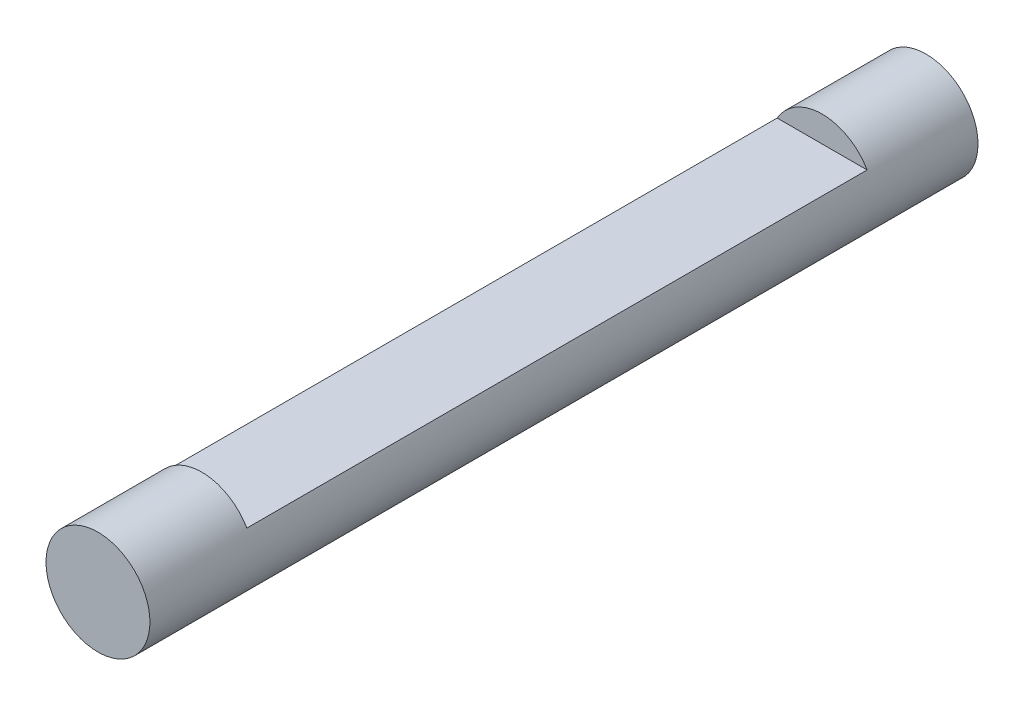
ISO-10303-21;
HEADER;
FILE_DESCRIPTION(('STEP AP214'),'2;1');
FILE_NAME('part.step','',(''),(''),'','','');
FILE_SCHEMA(('AUTOMOTIVE_DESIGN { 1 0 10303 214 1 1 1 1 }'));
ENDSEC;
DATA;
#1=APPLICATION_CONTEXT('core data for automotive mechanical design processes');
#2=APPLICATION_PROTOCOL_DEFINITION('international standard','automotive_design',2000,#1);
#3=PRODUCT_CONTEXT('',#1,'mechanical');
#4=PRODUCT('Part','Part','',(#3));
#5=PRODUCT_RELATED_PRODUCT_CATEGORY('part','',(#4));
#6=PRODUCT_DEFINITION_FORMATION('','',#4);
#7=PRODUCT_DEFINITION_CONTEXT('part definition',#1,'design');
#8=PRODUCT_DEFINITION('design','',#6,#7);
#9=PRODUCT_DEFINITION_SHAPE('','',#8);
#10=(LENGTH_UNIT() NAMED_UNIT(*) SI_UNIT(.MILLI.,.METRE.));
#11=(NAMED_UNIT(*) PLANE_ANGLE_UNIT() SI_UNIT($,.RADIAN.));
#12=(NAMED_UNIT(*) SI_UNIT($,.STERADIAN.) SOLID_ANGLE_UNIT());
#13=UNCERTAINTY_MEASURE_WITH_UNIT(LENGTH_MEASURE(1.E-05),#10,'distance_accuracy_value','');
#14=(GEOMETRIC_REPRESENTATION_CONTEXT(3) GLOBAL_UNCERTAINTY_ASSIGNED_CONTEXT((#13)) GLOBAL_UNIT_ASSIGNED_CONTEXT((#10,
#11,#12)) REPRESENTATION_CONTEXT('',''));
#15=CARTESIAN_POINT('',(0.,0.,0.));
#16=DIRECTION('',(0.,0.,1.));
#17=DIRECTION('',(1.,0.,0.));
#18=AXIS2_PLACEMENT_3D('',#15,#16,#17);
#19=CARTESIAN_POINT('',(0.,0.,75.0737084989847));
#20=DIRECTION('',(0.,0.,-1.));
#21=DIRECTION('',(-1.,0.,0.));
#22=AXIS2_PLACEMENT_3D('',#19,#20,#21);
#23=CYLINDRICAL_SURFACE('',#22,4.);
#24=CARTESIAN_POINT('',(0.,0.,63.76));
#25=DIRECTION('',(0.,0.,-1.));
#26=DIRECTION('',(-1.,0.,0.));
#27=AXIS2_PLACEMENT_3D('',#24,#25,#26);
#28=CIRCLE('',#27,4.);
#29=CARTESIAN_POINT('',(-4.,0.,63.76));
#30=VERTEX_POINT('',#29);
#31=EDGE_CURVE('E71',#30,#30,#28,.T.);
#32=ORIENTED_EDGE('',*,*,#31,.T.);
#33=EDGE_LOOP('',(#32));
#34=FACE_BOUND('',#33,.T.);
#35=CARTESIAN_POINT('',(0.,0.,0.));
#36=DIRECTION('',(0.,0.,1.));
#37=DIRECTION('',(1.,0.,0.));
#38=AXIS2_PLACEMENT_3D('',#35,#36,#37);
#39=CIRCLE('',#38,4.);
#40=CARTESIAN_POINT('',(4.,0.,0.));
#41=VERTEX_POINT('',#40);
#42=EDGE_CURVE('E68',#41,#41,#39,.T.);
#43=ORIENTED_EDGE('',*,*,#42,.T.);
#44=EDGE_LOOP('',(#43));
#45=FACE_BOUND('',#44,.T.);
#46=DIRECTION('',(0.,0.,-1.));
#47=VECTOR('',#46,1.);
#48=CARTESIAN_POINT('',(3.46410161513775,2.,75.0737084989847));
#49=LINE('',#48,#47);
#50=CARTESIAN_POINT('',(3.46410161513775,2.,55.76));
#51=VERTEX_POINT('',#50);
#52=CARTESIAN_POINT('',(3.46410161513775,2.,8.));
#53=VERTEX_POINT('',#52);
#54=EDGE_CURVE('E11',#51,#53,#49,.T.);
#55=ORIENTED_EDGE('',*,*,#54,.F.);
#56=CARTESIAN_POINT('',(0.,0.,55.76));
#57=DIRECTION('',(0.,0.,-1.));
#58=DIRECTION('',(-1.,0.,0.));
#59=AXIS2_PLACEMENT_3D('',#56,#57,#58);
#60=CIRCLE('',#59,4.);
#61=CARTESIAN_POINT('',(-3.46410161513775,2.,55.76));
#62=VERTEX_POINT('',#61);
#63=EDGE_CURVE('E40',#62,#51,#60,.T.);
#64=ORIENTED_EDGE('',*,*,#63,.F.);
#65=DIRECTION('',(0.,0.,-1.));
#66=VECTOR('',#65,1.);
#67=CARTESIAN_POINT('',(-3.46410161513775,2.,75.0737084989847));
#68=LINE('',#67,#66);
#69=CARTESIAN_POINT('',(-3.46410161513775,2.,8.00000000000001));
#70=VERTEX_POINT('',#69);
#71=EDGE_CURVE('E62',#70,#62,#68,.F.);
#72=ORIENTED_EDGE('',*,*,#71,.F.);
#73=CARTESIAN_POINT('',(0.,0.,8.00000000000001));
#74=DIRECTION('',(0.,0.,1.));
#75=DIRECTION('',(1.,0.,0.));
#76=AXIS2_PLACEMENT_3D('',#73,#74,#75);
#77=CIRCLE('',#76,4.);
#78=EDGE_CURVE('E61',#53,#70,#77,.T.);
#79=ORIENTED_EDGE('',*,*,#78,.F.);
#80=EDGE_LOOP('',(#55,#64,#72,#79));
#81=FACE_BOUND('',#80,.T.);
#82=ADVANCED_FACE('F33',(#34,#45,#81),#23,.T.);
#83=CARTESIAN_POINT('',(0.,0.,0.));
#84=DIRECTION('',(0.,0.,1.));
#85=DIRECTION('',(1.,0.,0.));
#86=AXIS2_PLACEMENT_3D('',#83,#84,#85);
#87=PLANE('',#86);
#88=ORIENTED_EDGE('',*,*,#42,.F.);
#89=EDGE_LOOP('',(#88));
#90=FACE_BOUND('',#89,.T.);
#91=ADVANCED_FACE('F86',(#90),#87,.F.);
#92=CARTESIAN_POINT('',(-5.24688900946858,-2.9103531954607,63.76));
#93=DIRECTION('',(0.,0.,-1.));
#94=DIRECTION('',(-0.874481501577933,-0.485058865910112,0.));
#95=AXIS2_PLACEMENT_3D('',#92,#93,#94);
#96=PLANE('',#95);
#97=ORIENTED_EDGE('',*,*,#31,.F.);
#98=EDGE_LOOP('',(#97));
#99=FACE_BOUND('',#98,.T.);
#100=ADVANCED_FACE('F79',(#99),#96,.F.);
#101=CARTESIAN_POINT('',(-3.99999999999999,4.,55.76));
#102=DIRECTION('',(0.,0.,-1.));
#103=DIRECTION('',(-1.,0.,0.));
#104=AXIS2_PLACEMENT_3D('',#101,#102,#103);
#105=PLANE('',#104);
#106=ORIENTED_EDGE('',*,*,#63,.T.);
#107=DIRECTION('',(1.,0.,0.));
#108=VECTOR('',#107,1.);
#109=CARTESIAN_POINT('',(-3.99999999999999,2.,55.76));
#110=LINE('',#109,#108);
#111=EDGE_CURVE('E66',#62,#51,#110,.T.);
#112=ORIENTED_EDGE('',*,*,#111,.F.);
#113=EDGE_LOOP('',(#106,#112));
#114=FACE_BOUND('',#113,.T.);
#115=ADVANCED_FACE('F77',(#114),#105,.T.);
#116=CARTESIAN_POINT('',(-4.,4.,8.));
#117=DIRECTION('',(0.,0.,1.));
#118=DIRECTION('',(1.,0.,0.));
#119=AXIS2_PLACEMENT_3D('',#116,#117,#118);
#120=PLANE('',#119);
#121=DIRECTION('',(-1.,0.,0.));
#122=VECTOR('',#121,1.);
#123=CARTESIAN_POINT('',(-4.,2.,8.));
#124=LINE('',#123,#122);
#125=EDGE_CURVE('E46',#53,#70,#124,.T.);
#126=ORIENTED_EDGE('',*,*,#125,.F.);
#127=ORIENTED_EDGE('',*,*,#78,.T.);
#128=EDGE_LOOP('',(#126,#127));
#129=FACE_BOUND('',#128,.T.);
#130=ADVANCED_FACE('F67',(#129),#120,.T.);
#131=CARTESIAN_POINT('',(0.,2.,0.));
#132=DIRECTION('',(0.,1.,0.));
#133=DIRECTION('',(0.,0.,1.));
#134=AXIS2_PLACEMENT_3D('',#131,#132,#133);
#135=PLANE('',#134);
#136=ORIENTED_EDGE('',*,*,#54,.T.);
#137=ORIENTED_EDGE('',*,*,#125,.T.);
#138=ORIENTED_EDGE('',*,*,#71,.T.);
#139=ORIENTED_EDGE('',*,*,#111,.T.);
#140=EDGE_LOOP('',(#136,#137,#138,#139));
#141=FACE_BOUND('',#140,.T.);
#142=ADVANCED_FACE('F65',(#141),#135,.T.);
#143=CLOSED_SHELL('',(#82,#91,#100,#115,#130,#142));
#144=MANIFOLD_SOLID_BREP('B2',#143);
#145=ADVANCED_BREP_SHAPE_REPRESENTATION('',(#18,#144),#14);
#146=SHAPE_DEFINITION_REPRESENTATION(#9,#145);
ENDSEC;
END-ISO-10303-21;
